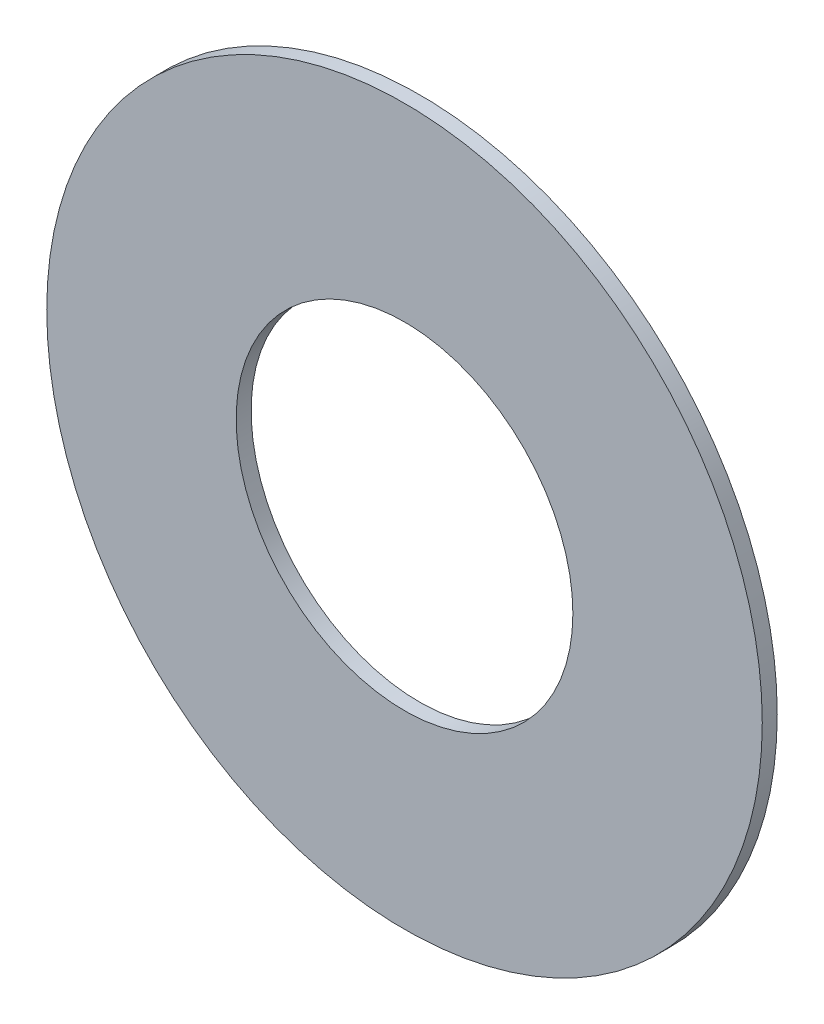
ISO-10303-21;
HEADER;
FILE_DESCRIPTION(('STEP AP214'),'2;1');
FILE_NAME('part.step','',(''),(''),'','','');
FILE_SCHEMA(('AUTOMOTIVE_DESIGN { 1 0 10303 214 1 1 1 1 }'));
ENDSEC;
DATA;
#1=APPLICATION_CONTEXT('core data for automotive mechanical design processes');
#2=APPLICATION_PROTOCOL_DEFINITION('international standard','automotive_design',2000,#1);
#3=PRODUCT_CONTEXT('',#1,'mechanical');
#4=PRODUCT('Part','Part','',(#3));
#5=PRODUCT_RELATED_PRODUCT_CATEGORY('part','',(#4));
#6=PRODUCT_DEFINITION_FORMATION('','',#4);
#7=PRODUCT_DEFINITION_CONTEXT('part definition',#1,'design');
#8=PRODUCT_DEFINITION('design','',#6,#7);
#9=PRODUCT_DEFINITION_SHAPE('','',#8);
#10=(LENGTH_UNIT() NAMED_UNIT(*) SI_UNIT(.MILLI.,.METRE.));
#11=(NAMED_UNIT(*) PLANE_ANGLE_UNIT() SI_UNIT($,.RADIAN.));
#12=(NAMED_UNIT(*) SI_UNIT($,.STERADIAN.) SOLID_ANGLE_UNIT());
#13=UNCERTAINTY_MEASURE_WITH_UNIT(LENGTH_MEASURE(1.E-05),#10,'distance_accuracy_value','');
#14=(GEOMETRIC_REPRESENTATION_CONTEXT(3) GLOBAL_UNCERTAINTY_ASSIGNED_CONTEXT((#13)) GLOBAL_UNIT_ASSIGNED_CONTEXT((#10,
#11,#12)) REPRESENTATION_CONTEXT('',''));
#15=CARTESIAN_POINT('',(0.,0.,0.));
#16=DIRECTION('',(0.,0.,1.));
#17=DIRECTION('',(1.,0.,0.));
#18=AXIS2_PLACEMENT_3D('',#15,#16,#17);
#19=CARTESIAN_POINT('',(0.,0.,0.));
#20=DIRECTION('',(0.,0.,-1.));
#21=DIRECTION('',(1.,0.,0.));
#22=AXIS2_PLACEMENT_3D('',#19,#20,#21);
#23=CYLINDRICAL_SURFACE('',#22,0.8499983);
#24=CARTESIAN_POINT('',(0.,0.,0.03556));
#25=DIRECTION('',(0.,0.,1.));
#26=DIRECTION('',(1.,0.,0.));
#27=AXIS2_PLACEMENT_3D('',#24,#25,#26);
#28=CIRCLE('',#27,0.8499983);
#29=CARTESIAN_POINT('',(0.8499983,0.,0.03556));
#30=VERTEX_POINT('',#29);
#31=EDGE_CURVE('E11',#30,#30,#28,.T.);
#32=ORIENTED_EDGE('',*,*,#31,.F.);
#33=DIRECTION('',(0.,0.,1.));
#34=VECTOR('',#33,1.);
#35=CARTESIAN_POINT('',(0.8499983,0.,0.));
#36=LINE('',#35,#34);
#37=CARTESIAN_POINT('',(0.8499983,0.,0.));
#38=VERTEX_POINT('',#37);
#39=EDGE_CURVE('E24',#38,#30,#36,.T.);
#40=ORIENTED_EDGE('',*,*,#39,.F.);
#41=CARTESIAN_POINT('',(0.,0.,0.));
#42=DIRECTION('',(0.,0.,1.));
#43=DIRECTION('',(1.,0.,0.));
#44=AXIS2_PLACEMENT_3D('',#41,#42,#43);
#45=CIRCLE('',#44,0.8499983);
#46=EDGE_CURVE('E46',#38,#38,#45,.T.);
#47=ORIENTED_EDGE('',*,*,#46,.T.);
#48=ORIENTED_EDGE('',*,*,#39,.T.);
#49=EDGE_LOOP('',(#32,#40,#47,#48));
#50=FACE_BOUND('',#49,.T.);
#51=ADVANCED_FACE('F17',(#50),#23,.T.);
#52=CARTESIAN_POINT('',(0.,0.,0.));
#53=DIRECTION('',(0.,0.,-1.));
#54=DIRECTION('',(1.,0.,0.));
#55=AXIS2_PLACEMENT_3D('',#52,#53,#54);
#56=CYLINDRICAL_SURFACE('',#55,0.3999992);
#57=DIRECTION('',(0.,0.,1.));
#58=VECTOR('',#57,1.);
#59=CARTESIAN_POINT('',(0.3999992,0.,0.));
#60=LINE('',#59,#58);
#61=CARTESIAN_POINT('',(0.3999992,0.,0.));
#62=VERTEX_POINT('',#61);
#63=CARTESIAN_POINT('',(0.3999992,0.,0.03556));
#64=VERTEX_POINT('',#63);
#65=EDGE_CURVE('E40',#62,#64,#60,.T.);
#66=ORIENTED_EDGE('',*,*,#65,.T.);
#67=CARTESIAN_POINT('',(0.,0.,0.03556));
#68=DIRECTION('',(0.,0.,1.));
#69=DIRECTION('',(1.,0.,0.));
#70=AXIS2_PLACEMENT_3D('',#67,#68,#69);
#71=CIRCLE('',#70,0.3999992);
#72=EDGE_CURVE('E45',#64,#64,#71,.T.);
#73=ORIENTED_EDGE('',*,*,#72,.T.);
#74=ORIENTED_EDGE('',*,*,#65,.F.);
#75=CARTESIAN_POINT('',(0.,0.,0.));
#76=DIRECTION('',(0.,0.,1.));
#77=DIRECTION('',(1.,0.,0.));
#78=AXIS2_PLACEMENT_3D('',#75,#76,#77);
#79=CIRCLE('',#78,0.3999992);
#80=EDGE_CURVE('E43',#62,#62,#79,.T.);
#81=ORIENTED_EDGE('',*,*,#80,.F.);
#82=EDGE_LOOP('',(#66,#73,#74,#81));
#83=FACE_BOUND('',#82,.T.);
#84=ADVANCED_FACE('F42',(#83),#56,.F.);
#85=CARTESIAN_POINT('',(0.8499983,0.,0.));
#86=DIRECTION('',(0.,0.,-1.));
#87=DIRECTION('',(-1.,0.,0.));
#88=AXIS2_PLACEMENT_3D('',#85,#86,#87);
#89=PLANE('',#88);
#90=ORIENTED_EDGE('',*,*,#46,.F.);
#91=EDGE_LOOP('',(#90));
#92=FACE_BOUND('',#91,.T.);
#93=ORIENTED_EDGE('',*,*,#80,.T.);
#94=EDGE_LOOP('',(#93));
#95=FACE_BOUND('',#94,.T.);
#96=ADVANCED_FACE('F49',(#92,#95),#89,.T.);
#97=CARTESIAN_POINT('',(0.8499983,0.,0.03556));
#98=DIRECTION('',(0.,0.,-1.));
#99=DIRECTION('',(-1.,0.,0.));
#100=AXIS2_PLACEMENT_3D('',#97,#98,#99);
#101=PLANE('',#100);
#102=ORIENTED_EDGE('',*,*,#31,.T.);
#103=EDGE_LOOP('',(#102));
#104=FACE_BOUND('',#103,.T.);
#105=ORIENTED_EDGE('',*,*,#72,.F.);
#106=EDGE_LOOP('',(#105));
#107=FACE_BOUND('',#106,.T.);
#108=ADVANCED_FACE('F56',(#104,#107),#101,.F.);
#109=CLOSED_SHELL('',(#51,#84,#96,#108));
#110=MANIFOLD_SOLID_BREP('B1',#109);
#111=ADVANCED_BREP_SHAPE_REPRESENTATION('',(#18,#110),#14);
#112=SHAPE_DEFINITION_REPRESENTATION(#9,#111);
ENDSEC;
END-ISO-10303-21;
